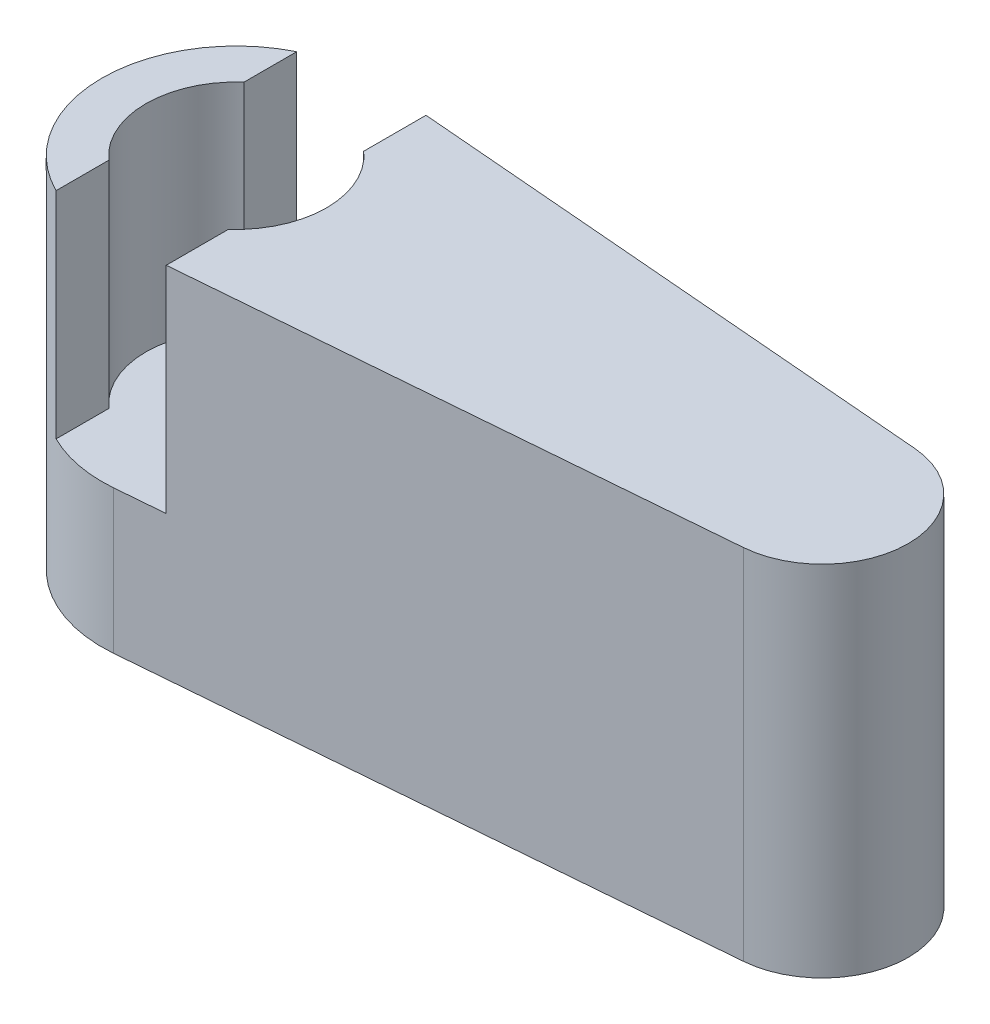
ISO-10303-21;
HEADER;
FILE_DESCRIPTION(('STEP AP214'),'2;1');
FILE_NAME('part.step','',(''),(''),'','','');
FILE_SCHEMA(('AUTOMOTIVE_DESIGN { 1 0 10303 214 1 1 1 1 }'));
ENDSEC;
DATA;
#1=APPLICATION_CONTEXT('core data for automotive mechanical design processes');
#2=APPLICATION_PROTOCOL_DEFINITION('international standard','automotive_design',2000,#1);
#3=PRODUCT_CONTEXT('',#1,'mechanical');
#4=PRODUCT('Part','Part','',(#3));
#5=PRODUCT_RELATED_PRODUCT_CATEGORY('part','',(#4));
#6=PRODUCT_DEFINITION_FORMATION('','',#4);
#7=PRODUCT_DEFINITION_CONTEXT('part definition',#1,'design');
#8=PRODUCT_DEFINITION('design','',#6,#7);
#9=PRODUCT_DEFINITION_SHAPE('','',#8);
#10=(LENGTH_UNIT() NAMED_UNIT(*) SI_UNIT(.MILLI.,.METRE.));
#11=(NAMED_UNIT(*) PLANE_ANGLE_UNIT() SI_UNIT($,.RADIAN.));
#12=(NAMED_UNIT(*) SI_UNIT($,.STERADIAN.) SOLID_ANGLE_UNIT());
#13=UNCERTAINTY_MEASURE_WITH_UNIT(LENGTH_MEASURE(1.E-05),#10,'distance_accuracy_value','');
#14=(GEOMETRIC_REPRESENTATION_CONTEXT(3) GLOBAL_UNCERTAINTY_ASSIGNED_CONTEXT((#13)) GLOBAL_UNIT_ASSIGNED_CONTEXT((#10,
#11,#12)) REPRESENTATION_CONTEXT('',''));
#15=CARTESIAN_POINT('',(0.,0.,0.));
#16=DIRECTION('',(0.,0.,1.));
#17=DIRECTION('',(1.,0.,0.));
#18=AXIS2_PLACEMENT_3D('',#15,#16,#17);
#19=CARTESIAN_POINT('',(0.,10.,0.));
#20=DIRECTION('',(0.,1.,0.));
#21=DIRECTION('',(0.,0.,1.));
#22=AXIS2_PLACEMENT_3D('',#19,#20,#21);
#23=PLANE('',#22);
#24=DIRECTION('',(0.,0.,-1.));
#25=VECTOR('',#24,1.);
#26=CARTESIAN_POINT('',(1.67,10.,-5.52));
#27=LINE('',#26,#25);
#28=CARTESIAN_POINT('',(1.67,10.,-1.88719368375373));
#29=VERTEX_POINT('',#28);
#30=CARTESIAN_POINT('',(1.67,10.,-3.62448638558928));
#31=VERTEX_POINT('',#30);
#32=EDGE_CURVE('E179',#29,#31,#27,.T.);
#33=ORIENTED_EDGE('',*,*,#32,.F.);
#34=CARTESIAN_POINT('',(0.,10.,0.));
#35=DIRECTION('',(0.,1.,0.));
#36=DIRECTION('',(0.,0.,1.));
#37=AXIS2_PLACEMENT_3D('',#34,#35,#36);
#38=CIRCLE('',#37,2.52);
#39=CARTESIAN_POINT('',(1.67,10.,1.88719368375373));
#40=VERTEX_POINT('',#39);
#41=EDGE_CURVE('E170',#40,#29,#38,.T.);
#42=ORIENTED_EDGE('',*,*,#41,.F.);
#43=DIRECTION('',(0.,0.,-1.));
#44=VECTOR('',#43,1.);
#45=CARTESIAN_POINT('',(1.67,10.,0.));
#46=LINE('',#45,#44);
#47=CARTESIAN_POINT('',(1.67,10.,3.62448638558928));
#48=VERTEX_POINT('',#47);
#49=EDGE_CURVE('E54',#48,#40,#46,.T.);
#50=ORIENTED_EDGE('',*,*,#49,.F.);
#51=DIRECTION('',(0.996585366165157,0.,-0.0825688073394495));
#52=VECTOR('',#51,1.);
#53=CARTESIAN_POINT('',(0.309633027522939,10.,3.73719512311934));
#54=LINE('',#53,#52);
#55=CARTESIAN_POINT('',(16.5481651376147,10.,2.39180487879638));
#56=VERTEX_POINT('',#55);
#57=EDGE_CURVE('E220',#48,#56,#54,.T.);
#58=ORIENTED_EDGE('',*,*,#57,.T.);
#59=CARTESIAN_POINT('',(16.35,10.,0.));
#60=DIRECTION('',(0.,1.,0.));
#61=DIRECTION('',(0.,0.,1.));
#62=AXIS2_PLACEMENT_3D('',#59,#60,#61);
#63=CIRCLE('',#62,2.4);
#64=CARTESIAN_POINT('',(16.5481651376147,10.,-2.39180487879638));
#65=VERTEX_POINT('',#64);
#66=EDGE_CURVE('E70',#56,#65,#63,.T.);
#67=ORIENTED_EDGE('',*,*,#66,.T.);
#68=DIRECTION('',(-0.996585366165157,0.,-0.0825688073394494));
#69=VECTOR('',#68,1.);
#70=CARTESIAN_POINT('',(0.309633027522939,10.,-3.73719512311934));
#71=LINE('',#70,#69);
#72=EDGE_CURVE('E104',#65,#31,#71,.T.);
#73=ORIENTED_EDGE('',*,*,#72,.T.);
#74=EDGE_LOOP('',(#33,#42,#50,#58,#67,#73));
#75=FACE_BOUND('',#74,.T.);
#76=ADVANCED_FACE('F45',(#75),#23,.T.);
#77=CARTESIAN_POINT('',(0.,10.,0.));
#78=DIRECTION('',(0.,-1.,0.));
#79=DIRECTION('',(0.,0.,-1.));
#80=AXIS2_PLACEMENT_3D('',#77,#78,#79);
#81=CYLINDRICAL_SURFACE('',#80,3.75);
#82=CARTESIAN_POINT('',(0.,10.,0.));
#83=DIRECTION('',(0.,1.,0.));
#84=DIRECTION('',(0.,0.,1.));
#85=AXIS2_PLACEMENT_3D('',#82,#83,#84);
#86=CIRCLE('',#85,3.75);
#87=CARTESIAN_POINT('',(-1.67,10.,-3.35761820342933));
#88=VERTEX_POINT('',#87);
#89=CARTESIAN_POINT('',(-1.67,10.,3.35761820342933));
#90=VERTEX_POINT('',#89);
#91=EDGE_CURVE('E114',#88,#90,#86,.T.);
#92=ORIENTED_EDGE('',*,*,#91,.F.);
#93=DIRECTION('',(0.,-1.,0.));
#94=VECTOR('',#93,1.);
#95=CARTESIAN_POINT('',(-1.67,10.,-3.35761820342933));
#96=LINE('',#95,#94);
#97=CARTESIAN_POINT('',(-1.67,4.,-3.35761820342933));
#98=VERTEX_POINT('',#97);
#99=EDGE_CURVE('E210',#88,#98,#96,.T.);
#100=ORIENTED_EDGE('',*,*,#99,.T.);
#101=CARTESIAN_POINT('',(0.,4.,0.));
#102=DIRECTION('',(0.,1.,0.));
#103=DIRECTION('',(0.,0.,1.));
#104=AXIS2_PLACEMENT_3D('',#101,#102,#103);
#105=CIRCLE('',#104,3.75);
#106=CARTESIAN_POINT('',(0.309633027522939,4.,-3.73719512311934));
#107=VERTEX_POINT('',#106);
#108=EDGE_CURVE('E99',#107,#98,#105,.T.);
#109=ORIENTED_EDGE('',*,*,#108,.F.);
#110=DIRECTION('',(0.,-1.,0.));
#111=VECTOR('',#110,1.);
#112=CARTESIAN_POINT('',(0.309633027522939,10.,-3.73719512311934));
#113=LINE('',#112,#111);
#114=CARTESIAN_POINT('',(0.309633027522939,0.,-3.73719512311934));
#115=VERTEX_POINT('',#114);
#116=EDGE_CURVE('E90',#107,#115,#113,.T.);
#117=ORIENTED_EDGE('',*,*,#116,.T.);
#118=CARTESIAN_POINT('',(0.,0.,0.));
#119=DIRECTION('',(0.,1.,0.));
#120=DIRECTION('',(0.,0.,1.));
#121=AXIS2_PLACEMENT_3D('',#118,#119,#120);
#122=CIRCLE('',#121,3.75);
#123=CARTESIAN_POINT('',(0.309633027522939,0.,3.73719512311934));
#124=VERTEX_POINT('',#123);
#125=EDGE_CURVE('E95',#115,#124,#122,.T.);
#126=ORIENTED_EDGE('',*,*,#125,.T.);
#127=DIRECTION('',(0.,-1.,0.));
#128=VECTOR('',#127,1.);
#129=CARTESIAN_POINT('',(0.309633027522939,10.,3.73719512311934));
#130=LINE('',#129,#128);
#131=CARTESIAN_POINT('',(0.309633027522939,4.,3.73719512311934));
#132=VERTEX_POINT('',#131);
#133=EDGE_CURVE('E140',#132,#124,#130,.T.);
#134=ORIENTED_EDGE('',*,*,#133,.F.);
#135=CARTESIAN_POINT('',(-1.67,4.,3.35761820342933));
#136=VERTEX_POINT('',#135);
#137=EDGE_CURVE('E121',#136,#132,#105,.T.);
#138=ORIENTED_EDGE('',*,*,#137,.F.);
#139=DIRECTION('',(0.,-1.,0.));
#140=VECTOR('',#139,1.);
#141=CARTESIAN_POINT('',(-1.67,10.,3.35761820342933));
#142=LINE('',#141,#140);
#143=EDGE_CURVE('E194',#136,#90,#142,.F.);
#144=ORIENTED_EDGE('',*,*,#143,.T.);
#145=EDGE_LOOP('',(#92,#100,#109,#117,#126,#134,#138,#144));
#146=FACE_BOUND('',#145,.T.);
#147=ADVANCED_FACE('F47',(#146),#81,.T.);
#148=CARTESIAN_POINT('',(0.309633027522939,10.,3.73719512311934));
#149=DIRECTION('',(-0.0825688073394495,0.,-0.996585366165157));
#150=DIRECTION('',(-0.996585366165158,0.,0.0825688073394495));
#151=AXIS2_PLACEMENT_3D('',#148,#149,#150);
#152=PLANE('',#151);
#153=ORIENTED_EDGE('',*,*,#57,.F.);
#154=DIRECTION('',(0.,-1.,0.));
#155=VECTOR('',#154,1.);
#156=CARTESIAN_POINT('',(1.67,10.,3.62448638558928));
#157=LINE('',#156,#155);
#158=CARTESIAN_POINT('',(1.67,4.,3.62448638558928));
#159=VERTEX_POINT('',#158);
#160=EDGE_CURVE('E161',#48,#159,#157,.T.);
#161=ORIENTED_EDGE('',*,*,#160,.T.);
#162=DIRECTION('',(0.996585366165158,0.,-0.0825688073394495));
#163=VECTOR('',#162,1.);
#164=CARTESIAN_POINT('',(0.309633027522939,4.,3.73719512311934));
#165=LINE('',#164,#163);
#166=EDGE_CURVE('E127',#132,#159,#165,.T.);
#167=ORIENTED_EDGE('',*,*,#166,.F.);
#168=ORIENTED_EDGE('',*,*,#133,.T.);
#169=DIRECTION('',(0.996585366165157,0.,-0.0825688073394495));
#170=VECTOR('',#169,1.);
#171=CARTESIAN_POINT('',(0.309633027522939,0.,3.73719512311934));
#172=LINE('',#171,#170);
#173=CARTESIAN_POINT('',(16.5481651376147,0.,2.39180487879638));
#174=VERTEX_POINT('',#173);
#175=EDGE_CURVE('E119',#124,#174,#172,.T.);
#176=ORIENTED_EDGE('',*,*,#175,.T.);
#177=DIRECTION('',(0.,-1.,0.));
#178=VECTOR('',#177,1.);
#179=CARTESIAN_POINT('',(16.5481651376147,10.,2.39180487879638));
#180=LINE('',#179,#178);
#181=EDGE_CURVE('E136',#56,#174,#180,.T.);
#182=ORIENTED_EDGE('',*,*,#181,.F.);
#183=EDGE_LOOP('',(#153,#161,#167,#168,#176,#182));
#184=FACE_BOUND('',#183,.T.);
#185=ADVANCED_FACE('F287',(#184),#152,.F.);
#186=CARTESIAN_POINT('',(16.35,10.,0.));
#187=DIRECTION('',(0.,-1.,0.));
#188=DIRECTION('',(0.,0.,-1.));
#189=AXIS2_PLACEMENT_3D('',#186,#187,#188);
#190=CYLINDRICAL_SURFACE('',#189,2.4);
#191=CARTESIAN_POINT('',(16.35,0.,0.));
#192=DIRECTION('',(0.,1.,0.));
#193=DIRECTION('',(0.,0.,1.));
#194=AXIS2_PLACEMENT_3D('',#191,#192,#193);
#195=CIRCLE('',#194,2.4);
#196=CARTESIAN_POINT('',(16.5481651376147,0.,-2.39180487879638));
#197=VERTEX_POINT('',#196);
#198=EDGE_CURVE('E115',#174,#197,#195,.T.);
#199=ORIENTED_EDGE('',*,*,#198,.T.);
#200=DIRECTION('',(0.,-1.,0.));
#201=VECTOR('',#200,1.);
#202=CARTESIAN_POINT('',(16.5481651376147,10.,-2.39180487879638));
#203=LINE('',#202,#201);
#204=EDGE_CURVE('E103',#65,#197,#203,.T.);
#205=ORIENTED_EDGE('',*,*,#204,.F.);
#206=ORIENTED_EDGE('',*,*,#66,.F.);
#207=ORIENTED_EDGE('',*,*,#181,.T.);
#208=EDGE_LOOP('',(#199,#205,#206,#207));
#209=FACE_BOUND('',#208,.T.);
#210=ADVANCED_FACE('F290',(#209),#190,.T.);
#211=CARTESIAN_POINT('',(0.309633027522939,10.,-3.73719512311934));
#212=DIRECTION('',(-0.0825688073394494,0.,0.996585366165157));
#213=DIRECTION('',(0.996585366165158,0.,0.0825688073394494));
#214=AXIS2_PLACEMENT_3D('',#211,#212,#213);
#215=PLANE('',#214);
#216=DIRECTION('',(-0.996585366165158,0.,-0.0825688073394494));
#217=VECTOR('',#216,1.);
#218=CARTESIAN_POINT('',(0.309633027522939,4.,-3.73719512311934));
#219=LINE('',#218,#217);
#220=CARTESIAN_POINT('',(1.67,4.,-3.62448638558928));
#221=VERTEX_POINT('',#220);
#222=EDGE_CURVE('E11',#221,#107,#219,.T.);
#223=ORIENTED_EDGE('',*,*,#222,.F.);
#224=DIRECTION('',(0.,1.,0.));
#225=VECTOR('',#224,1.);
#226=CARTESIAN_POINT('',(1.67,10.,-3.62448638558928));
#227=LINE('',#226,#225);
#228=EDGE_CURVE('E206',#221,#31,#227,.T.);
#229=ORIENTED_EDGE('',*,*,#228,.T.);
#230=ORIENTED_EDGE('',*,*,#72,.F.);
#231=ORIENTED_EDGE('',*,*,#204,.T.);
#232=DIRECTION('',(-0.996585366165157,0.,-0.0825688073394494));
#233=VECTOR('',#232,1.);
#234=CARTESIAN_POINT('',(0.309633027522939,0.,-3.73719512311934));
#235=LINE('',#234,#233);
#236=EDGE_CURVE('E108',#197,#115,#235,.T.);
#237=ORIENTED_EDGE('',*,*,#236,.T.);
#238=ORIENTED_EDGE('',*,*,#116,.F.);
#239=EDGE_LOOP('',(#223,#229,#230,#231,#237,#238));
#240=FACE_BOUND('',#239,.T.);
#241=ADVANCED_FACE('F109',(#240),#215,.F.);
#242=DIRECTION('',(0.,0.,1.));
#243=VECTOR('',#242,1.);
#244=CARTESIAN_POINT('',(-1.67,10.,0.));
#245=LINE('',#244,#243);
#246=CARTESIAN_POINT('',(-1.67,10.,-1.88719368375374));
#247=VERTEX_POINT('',#246);
#248=EDGE_CURVE('E143',#88,#247,#245,.T.);
#249=ORIENTED_EDGE('',*,*,#248,.F.);
#250=ORIENTED_EDGE('',*,*,#91,.T.);
#251=DIRECTION('',(0.,0.,1.));
#252=VECTOR('',#251,1.);
#253=CARTESIAN_POINT('',(-1.67,10.,1.88719368375374));
#254=LINE('',#253,#252);
#255=CARTESIAN_POINT('',(-1.67,10.,1.88719368375374));
#256=VERTEX_POINT('',#255);
#257=EDGE_CURVE('E181',#256,#90,#254,.T.);
#258=ORIENTED_EDGE('',*,*,#257,.F.);
#259=CARTESIAN_POINT('',(0.,10.,0.));
#260=DIRECTION('',(0.,1.,0.));
#261=DIRECTION('',(0.,0.,1.));
#262=AXIS2_PLACEMENT_3D('',#259,#260,#261);
#263=CIRCLE('',#262,2.52);
#264=EDGE_CURVE('E61',#247,#256,#263,.T.);
#265=ORIENTED_EDGE('',*,*,#264,.F.);
#266=EDGE_LOOP('',(#249,#250,#258,#265));
#267=FACE_BOUND('',#266,.T.);
#268=ADVANCED_FACE('F297',(#267),#23,.T.);
#269=CARTESIAN_POINT('',(0.,0.,0.));
#270=DIRECTION('',(0.,1.,0.));
#271=DIRECTION('',(0.,0.,1.));
#272=AXIS2_PLACEMENT_3D('',#269,#270,#271);
#273=PLANE('',#272);
#274=ORIENTED_EDGE('',*,*,#125,.F.);
#275=ORIENTED_EDGE('',*,*,#236,.F.);
#276=ORIENTED_EDGE('',*,*,#198,.F.);
#277=ORIENTED_EDGE('',*,*,#175,.F.);
#278=EDGE_LOOP('',(#274,#275,#276,#277));
#279=FACE_BOUND('',#278,.T.);
#280=ADVANCED_FACE('F118',(#279),#273,.F.);
#281=CARTESIAN_POINT('',(0.,4.,0.));
#282=DIRECTION('',(0.,1.,0.));
#283=DIRECTION('',(0.,0.,1.));
#284=AXIS2_PLACEMENT_3D('',#281,#282,#283);
#285=PLANE('',#284);
#286=ORIENTED_EDGE('',*,*,#137,.T.);
#287=ORIENTED_EDGE('',*,*,#166,.T.);
#288=DIRECTION('',(0.,0.,-1.));
#289=VECTOR('',#288,1.);
#290=CARTESIAN_POINT('',(1.67,4.,5.52));
#291=LINE('',#290,#289);
#292=CARTESIAN_POINT('',(1.67,4.,1.88719368375373));
#293=VERTEX_POINT('',#292);
#294=EDGE_CURVE('E246',#159,#293,#291,.T.);
#295=ORIENTED_EDGE('',*,*,#294,.T.);
#296=CARTESIAN_POINT('',(0.,4.,0.));
#297=DIRECTION('',(0.,1.,0.));
#298=DIRECTION('',(0.,0.,1.));
#299=AXIS2_PLACEMENT_3D('',#296,#297,#298);
#300=CIRCLE('',#299,2.52);
#301=CARTESIAN_POINT('',(1.67,4.,-1.88719368375373));
#302=VERTEX_POINT('',#301);
#303=EDGE_CURVE('E173',#293,#302,#300,.T.);
#304=ORIENTED_EDGE('',*,*,#303,.T.);
#305=DIRECTION('',(0.,0.,-1.));
#306=VECTOR('',#305,1.);
#307=CARTESIAN_POINT('',(1.67,4.,-5.52));
#308=LINE('',#307,#306);
#309=EDGE_CURVE('E234',#302,#221,#308,.T.);
#310=ORIENTED_EDGE('',*,*,#309,.T.);
#311=ORIENTED_EDGE('',*,*,#222,.T.);
#312=ORIENTED_EDGE('',*,*,#108,.T.);
#313=DIRECTION('',(0.,0.,1.));
#314=VECTOR('',#313,1.);
#315=CARTESIAN_POINT('',(-1.67,4.,-1.88719368375374));
#316=LINE('',#315,#314);
#317=CARTESIAN_POINT('',(-1.67,4.,-1.88719368375374));
#318=VERTEX_POINT('',#317);
#319=EDGE_CURVE('E200',#98,#318,#316,.T.);
#320=ORIENTED_EDGE('',*,*,#319,.T.);
#321=CARTESIAN_POINT('',(0.,4.,0.));
#322=DIRECTION('',(0.,1.,0.));
#323=DIRECTION('',(0.,0.,1.));
#324=AXIS2_PLACEMENT_3D('',#321,#322,#323);
#325=CIRCLE('',#324,2.52);
#326=CARTESIAN_POINT('',(-1.67,4.,1.88719368375374));
#327=VERTEX_POINT('',#326);
#328=EDGE_CURVE('E185',#318,#327,#325,.T.);
#329=ORIENTED_EDGE('',*,*,#328,.T.);
#330=DIRECTION('',(0.,0.,1.));
#331=VECTOR('',#330,1.);
#332=CARTESIAN_POINT('',(-1.67,4.,1.88719368375374));
#333=LINE('',#332,#331);
#334=EDGE_CURVE('E252',#327,#136,#333,.T.);
#335=ORIENTED_EDGE('',*,*,#334,.T.);
#336=EDGE_LOOP('',(#286,#287,#295,#304,#310,#311,#312,#320,#329,#335));
#337=FACE_BOUND('',#336,.T.);
#338=ADVANCED_FACE('F238',(#337),#285,.T.);
#339=CARTESIAN_POINT('',(-1.67,4.,-1.88719368375374));
#340=DIRECTION('',(-1.,0.,0.));
#341=DIRECTION('',(0.,0.,1.));
#342=AXIS2_PLACEMENT_3D('',#339,#340,#341);
#343=PLANE('',#342);
#344=ORIENTED_EDGE('',*,*,#248,.T.);
#345=DIRECTION('',(0.,1.,0.));
#346=VECTOR('',#345,1.);
#347=CARTESIAN_POINT('',(-1.67,4.,-1.88719368375374));
#348=LINE('',#347,#346);
#349=EDGE_CURVE('E191',#318,#247,#348,.T.);
#350=ORIENTED_EDGE('',*,*,#349,.F.);
#351=ORIENTED_EDGE('',*,*,#319,.F.);
#352=ORIENTED_EDGE('',*,*,#99,.F.);
#353=EDGE_LOOP('',(#344,#350,#351,#352));
#354=FACE_BOUND('',#353,.T.);
#355=ADVANCED_FACE('F329',(#354),#343,.F.);
#356=CARTESIAN_POINT('',(1.67,4.,-5.52));
#357=DIRECTION('',(1.,0.,0.));
#358=DIRECTION('',(0.,0.,-1.));
#359=AXIS2_PLACEMENT_3D('',#356,#357,#358);
#360=PLANE('',#359);
#361=ORIENTED_EDGE('',*,*,#309,.F.);
#362=DIRECTION('',(0.,1.,0.));
#363=VECTOR('',#362,1.);
#364=CARTESIAN_POINT('',(1.67,4.,-1.88719368375373));
#365=LINE('',#364,#363);
#366=EDGE_CURVE('E175',#302,#29,#365,.T.);
#367=ORIENTED_EDGE('',*,*,#366,.T.);
#368=ORIENTED_EDGE('',*,*,#32,.T.);
#369=ORIENTED_EDGE('',*,*,#228,.F.);
#370=EDGE_LOOP('',(#361,#367,#368,#369));
#371=FACE_BOUND('',#370,.T.);
#372=ADVANCED_FACE('F232',(#371),#360,.F.);
#373=CARTESIAN_POINT('',(1.67,4.,5.52));
#374=DIRECTION('',(1.,0.,0.));
#375=DIRECTION('',(0.,0.,-1.));
#376=AXIS2_PLACEMENT_3D('',#373,#374,#375);
#377=PLANE('',#376);
#378=ORIENTED_EDGE('',*,*,#49,.T.);
#379=DIRECTION('',(0.,1.,0.));
#380=VECTOR('',#379,1.);
#381=CARTESIAN_POINT('',(1.67,4.,1.88719368375373));
#382=LINE('',#381,#380);
#383=EDGE_CURVE('E157',#293,#40,#382,.T.);
#384=ORIENTED_EDGE('',*,*,#383,.F.);
#385=ORIENTED_EDGE('',*,*,#294,.F.);
#386=ORIENTED_EDGE('',*,*,#160,.F.);
#387=EDGE_LOOP('',(#378,#384,#385,#386));
#388=FACE_BOUND('',#387,.T.);
#389=ADVANCED_FACE('F154',(#388),#377,.F.);
#390=CARTESIAN_POINT('',(-1.67,4.,1.88719368375374));
#391=DIRECTION('',(-1.,0.,0.));
#392=DIRECTION('',(0.,0.,1.));
#393=AXIS2_PLACEMENT_3D('',#390,#391,#392);
#394=PLANE('',#393);
#395=ORIENTED_EDGE('',*,*,#334,.F.);
#396=DIRECTION('',(0.,1.,0.));
#397=VECTOR('',#396,1.);
#398=CARTESIAN_POINT('',(-1.67,4.,1.88719368375374));
#399=LINE('',#398,#397);
#400=EDGE_CURVE('E176',#327,#256,#399,.T.);
#401=ORIENTED_EDGE('',*,*,#400,.T.);
#402=ORIENTED_EDGE('',*,*,#257,.T.);
#403=ORIENTED_EDGE('',*,*,#143,.F.);
#404=EDGE_LOOP('',(#395,#401,#402,#403));
#405=FACE_BOUND('',#404,.T.);
#406=ADVANCED_FACE('F316',(#405),#394,.F.);
#407=CARTESIAN_POINT('',(0.,4.,0.));
#408=DIRECTION('',(0.,1.,0.));
#409=DIRECTION('',(0.,0.,1.));
#410=AXIS2_PLACEMENT_3D('',#407,#408,#409);
#411=CYLINDRICAL_SURFACE('',#410,2.52);
#412=ORIENTED_EDGE('',*,*,#264,.T.);
#413=ORIENTED_EDGE('',*,*,#400,.F.);
#414=ORIENTED_EDGE('',*,*,#328,.F.);
#415=ORIENTED_EDGE('',*,*,#349,.T.);
#416=EDGE_LOOP('',(#412,#413,#414,#415));
#417=FACE_BOUND('',#416,.T.);
#418=ADVANCED_FACE('F268',(#417),#411,.F.);
#419=CARTESIAN_POINT('',(0.,4.,0.));
#420=DIRECTION('',(0.,1.,0.));
#421=DIRECTION('',(0.,0.,1.));
#422=AXIS2_PLACEMENT_3D('',#419,#420,#421);
#423=CYLINDRICAL_SURFACE('',#422,2.52);
#424=ORIENTED_EDGE('',*,*,#41,.T.);
#425=ORIENTED_EDGE('',*,*,#366,.F.);
#426=ORIENTED_EDGE('',*,*,#303,.F.);
#427=ORIENTED_EDGE('',*,*,#383,.T.);
#428=EDGE_LOOP('',(#424,#425,#426,#427));
#429=FACE_BOUND('',#428,.T.);
#430=ADVANCED_FACE('F168',(#429),#423,.F.);
#431=CLOSED_SHELL('',(#76,#147,#185,#210,#241,#268,#280,#338,#355,#372,#389,#406,#418,#430));
#432=MANIFOLD_SOLID_BREP('B2',#431);
#433=ADVANCED_BREP_SHAPE_REPRESENTATION('',(#18,#432),#14);
#434=SHAPE_DEFINITION_REPRESENTATION(#9,#433);
ENDSEC;
END-ISO-10303-21;
